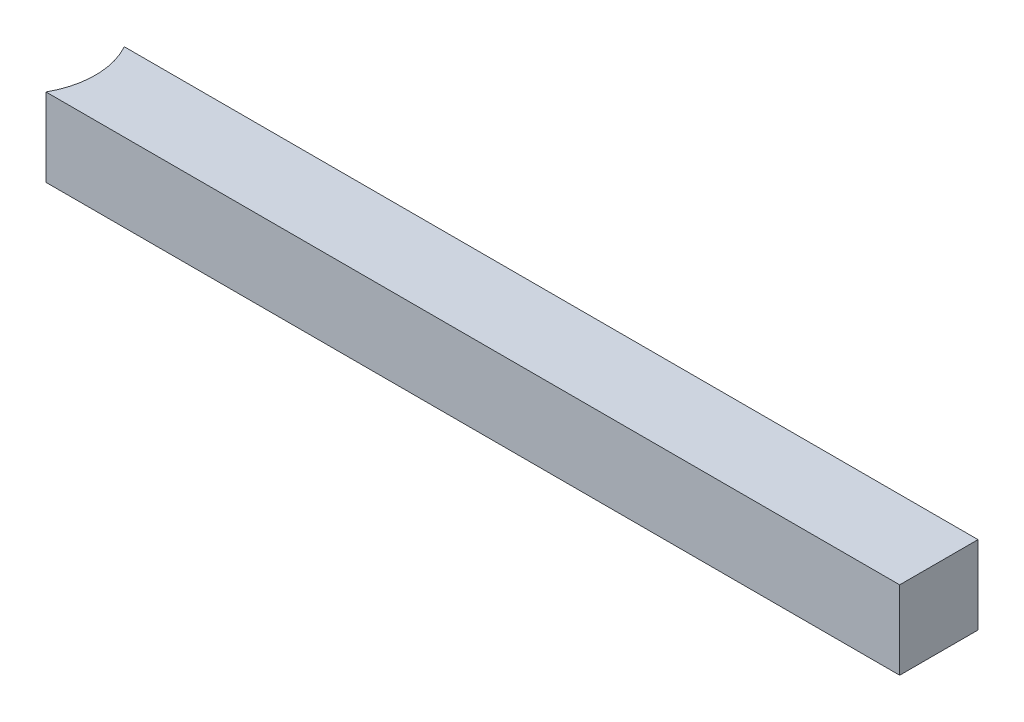
ISO-10303-21;
HEADER;
FILE_DESCRIPTION(('STEP AP214'),'2;1');
FILE_NAME('part.step','',(''),(''),'','','');
FILE_SCHEMA(('AUTOMOTIVE_DESIGN { 1 0 10303 214 1 1 1 1 }'));
ENDSEC;
DATA;
#1=APPLICATION_CONTEXT('core data for automotive mechanical design processes');
#2=APPLICATION_PROTOCOL_DEFINITION('international standard','automotive_design',2000,#1);
#3=PRODUCT_CONTEXT('',#1,'mechanical');
#4=PRODUCT('Part','Part','',(#3));
#5=PRODUCT_RELATED_PRODUCT_CATEGORY('part','',(#4));
#6=PRODUCT_DEFINITION_FORMATION('','',#4);
#7=PRODUCT_DEFINITION_CONTEXT('part definition',#1,'design');
#8=PRODUCT_DEFINITION('design','',#6,#7);
#9=PRODUCT_DEFINITION_SHAPE('','',#8);
#10=(LENGTH_UNIT() NAMED_UNIT(*) SI_UNIT(.MILLI.,.METRE.));
#11=(NAMED_UNIT(*) PLANE_ANGLE_UNIT() SI_UNIT($,.RADIAN.));
#12=(NAMED_UNIT(*) SI_UNIT($,.STERADIAN.) SOLID_ANGLE_UNIT());
#13=UNCERTAINTY_MEASURE_WITH_UNIT(LENGTH_MEASURE(1.E-05),#10,'distance_accuracy_value','');
#14=(GEOMETRIC_REPRESENTATION_CONTEXT(3) GLOBAL_UNCERTAINTY_ASSIGNED_CONTEXT((#13)) GLOBAL_UNIT_ASSIGNED_CONTEXT((#10,
#11,#12)) REPRESENTATION_CONTEXT('',''));
#15=CARTESIAN_POINT('',(0.,0.,0.));
#16=DIRECTION('',(0.,0.,1.));
#17=DIRECTION('',(1.,0.,0.));
#18=AXIS2_PLACEMENT_3D('',#15,#16,#17);
#19=CARTESIAN_POINT('',(306.07,12.7,-12.7));
#20=DIRECTION('',(0.,0.,1.));
#21=DIRECTION('',(0.,-1.,0.));
#22=AXIS2_PLACEMENT_3D('',#19,#20,#21);
#23=PLANE('',#22);
#24=DIRECTION('',(-1.,0.,0.));
#25=VECTOR('',#24,1.);
#26=CARTESIAN_POINT('',(306.07,-12.7,-12.7));
#27=LINE('',#26,#25);
#28=CARTESIAN_POINT('',(306.07,-12.7,-12.7));
#29=VERTEX_POINT('',#28);
#30=CARTESIAN_POINT('',(29.21,-12.7,-12.7));
#31=VERTEX_POINT('',#30);
#32=EDGE_CURVE('E93',#29,#31,#27,.T.);
#33=ORIENTED_EDGE('',*,*,#32,.T.);
#34=DIRECTION('',(0.,1.,0.));
#35=VECTOR('',#34,1.);
#36=CARTESIAN_POINT('',(29.21,-12.7,-12.7));
#37=LINE('',#36,#35);
#38=CARTESIAN_POINT('',(29.21,12.7,-12.7));
#39=VERTEX_POINT('',#38);
#40=EDGE_CURVE('E54',#31,#39,#37,.T.);
#41=ORIENTED_EDGE('',*,*,#40,.T.);
#42=DIRECTION('',(-1.,0.,0.));
#43=VECTOR('',#42,1.);
#44=CARTESIAN_POINT('',(306.07,12.7,-12.7));
#45=LINE('',#44,#43);
#46=CARTESIAN_POINT('',(306.07,12.7,-12.7));
#47=VERTEX_POINT('',#46);
#48=EDGE_CURVE('E11',#47,#39,#45,.T.);
#49=ORIENTED_EDGE('',*,*,#48,.F.);
#50=DIRECTION('',(0.,1.,0.));
#51=VECTOR('',#50,1.);
#52=CARTESIAN_POINT('',(306.07,12.7,-12.7));
#53=LINE('',#52,#51);
#54=EDGE_CURVE('E105',#29,#47,#53,.T.);
#55=ORIENTED_EDGE('',*,*,#54,.F.);
#56=EDGE_LOOP('',(#33,#41,#49,#55));
#57=FACE_BOUND('',#56,.T.);
#58=ADVANCED_FACE('F37',(#57),#23,.F.);
#59=CARTESIAN_POINT('',(306.07,12.7,12.7));
#60=DIRECTION('',(0.,-1.,0.));
#61=DIRECTION('',(0.,0.,-1.));
#62=AXIS2_PLACEMENT_3D('',#59,#60,#61);
#63=PLANE('',#62);
#64=ORIENTED_EDGE('',*,*,#48,.T.);
#65=CARTESIAN_POINT('',(6.48267668641995,12.7,0.));
#66=DIRECTION('',(0.,1.,0.));
#67=DIRECTION('',(0.,0.,1.));
#68=AXIS2_PLACEMENT_3D('',#65,#66,#67);
#69=CIRCLE('',#68,26.035);
#70=CARTESIAN_POINT('',(29.21,12.7,12.7));
#71=VERTEX_POINT('',#70);
#72=EDGE_CURVE('E40',#71,#39,#69,.T.);
#73=ORIENTED_EDGE('',*,*,#72,.F.);
#74=DIRECTION('',(-1.,0.,0.));
#75=VECTOR('',#74,1.);
#76=CARTESIAN_POINT('',(306.07,12.7,12.7));
#77=LINE('',#76,#75);
#78=CARTESIAN_POINT('',(306.07,12.7,12.7));
#79=VERTEX_POINT('',#78);
#80=EDGE_CURVE('E46',#79,#71,#77,.T.);
#81=ORIENTED_EDGE('',*,*,#80,.F.);
#82=DIRECTION('',(0.,0.,1.));
#83=VECTOR('',#82,1.);
#84=CARTESIAN_POINT('',(306.07,12.7,12.7));
#85=LINE('',#84,#83);
#86=EDGE_CURVE('E84',#47,#79,#85,.T.);
#87=ORIENTED_EDGE('',*,*,#86,.F.);
#88=EDGE_LOOP('',(#64,#73,#81,#87));
#89=FACE_BOUND('',#88,.T.);
#90=ADVANCED_FACE('F103',(#89),#63,.F.);
#91=CARTESIAN_POINT('',(306.07,12.7,12.7));
#92=DIRECTION('',(0.,0.,-1.));
#93=DIRECTION('',(0.,1.,0.));
#94=AXIS2_PLACEMENT_3D('',#91,#92,#93);
#95=PLANE('',#94);
#96=ORIENTED_EDGE('',*,*,#80,.T.);
#97=DIRECTION('',(0.,1.,0.));
#98=VECTOR('',#97,1.);
#99=CARTESIAN_POINT('',(29.21,-12.7,12.7));
#100=LINE('',#99,#98);
#101=CARTESIAN_POINT('',(29.21,-12.7,12.7));
#102=VERTEX_POINT('',#101);
#103=EDGE_CURVE('E63',#102,#71,#100,.T.);
#104=ORIENTED_EDGE('',*,*,#103,.F.);
#105=DIRECTION('',(-1.,0.,0.));
#106=VECTOR('',#105,1.);
#107=CARTESIAN_POINT('',(306.07,-12.7,12.7));
#108=LINE('',#107,#106);
#109=CARTESIAN_POINT('',(306.07,-12.7,12.7));
#110=VERTEX_POINT('',#109);
#111=EDGE_CURVE('E90',#110,#102,#108,.T.);
#112=ORIENTED_EDGE('',*,*,#111,.F.);
#113=DIRECTION('',(0.,-1.,0.));
#114=VECTOR('',#113,1.);
#115=CARTESIAN_POINT('',(306.07,12.7,12.7));
#116=LINE('',#115,#114);
#117=EDGE_CURVE('E77',#79,#110,#116,.T.);
#118=ORIENTED_EDGE('',*,*,#117,.F.);
#119=EDGE_LOOP('',(#96,#104,#112,#118));
#120=FACE_BOUND('',#119,.T.);
#121=ADVANCED_FACE('F91',(#120),#95,.F.);
#122=CARTESIAN_POINT('',(306.07,-12.7,12.7));
#123=DIRECTION('',(0.,1.,0.));
#124=DIRECTION('',(0.,0.,1.));
#125=AXIS2_PLACEMENT_3D('',#122,#123,#124);
#126=PLANE('',#125);
#127=ORIENTED_EDGE('',*,*,#111,.T.);
#128=CARTESIAN_POINT('',(6.48267668641995,-12.7,0.));
#129=DIRECTION('',(0.,1.,0.));
#130=DIRECTION('',(0.,0.,1.));
#131=AXIS2_PLACEMENT_3D('',#128,#129,#130);
#132=CIRCLE('',#131,26.035);
#133=EDGE_CURVE('E68',#102,#31,#132,.T.);
#134=ORIENTED_EDGE('',*,*,#133,.T.);
#135=ORIENTED_EDGE('',*,*,#32,.F.);
#136=DIRECTION('',(0.,0.,-1.));
#137=VECTOR('',#136,1.);
#138=CARTESIAN_POINT('',(306.07,-12.7,12.7));
#139=LINE('',#138,#137);
#140=EDGE_CURVE('E82',#110,#29,#139,.T.);
#141=ORIENTED_EDGE('',*,*,#140,.F.);
#142=EDGE_LOOP('',(#127,#134,#135,#141));
#143=FACE_BOUND('',#142,.T.);
#144=ADVANCED_FACE('F95',(#143),#126,.F.);
#145=CARTESIAN_POINT('',(306.07,0.,0.));
#146=DIRECTION('',(1.,0.,0.));
#147=DIRECTION('',(0.,0.,-1.));
#148=AXIS2_PLACEMENT_3D('',#145,#146,#147);
#149=PLANE('',#148);
#150=ORIENTED_EDGE('',*,*,#54,.T.);
#151=ORIENTED_EDGE('',*,*,#86,.T.);
#152=ORIENTED_EDGE('',*,*,#117,.T.);
#153=ORIENTED_EDGE('',*,*,#140,.T.);
#154=EDGE_LOOP('',(#150,#151,#152,#153));
#155=FACE_BOUND('',#154,.T.);
#156=ADVANCED_FACE('F80',(#155),#149,.T.);
#157=CARTESIAN_POINT('',(6.48267668641995,-12.7,0.));
#158=DIRECTION('',(0.,1.,0.));
#159=DIRECTION('',(0.,0.,1.));
#160=AXIS2_PLACEMENT_3D('',#157,#158,#159);
#161=CYLINDRICAL_SURFACE('',#160,26.035);
#162=ORIENTED_EDGE('',*,*,#40,.F.);
#163=ORIENTED_EDGE('',*,*,#133,.F.);
#164=ORIENTED_EDGE('',*,*,#103,.T.);
#165=ORIENTED_EDGE('',*,*,#72,.T.);
#166=EDGE_LOOP('',(#162,#163,#164,#165));
#167=FACE_BOUND('',#166,.T.);
#168=ADVANCED_FACE('F124',(#167),#161,.F.);
#169=CLOSED_SHELL('',(#58,#90,#121,#144,#156,#168));
#170=MANIFOLD_SOLID_BREP('B2',#169);
#171=ADVANCED_BREP_SHAPE_REPRESENTATION('',(#18,#170),#14);
#172=SHAPE_DEFINITION_REPRESENTATION(#9,#171);
ENDSEC;
END-ISO-10303-21;
